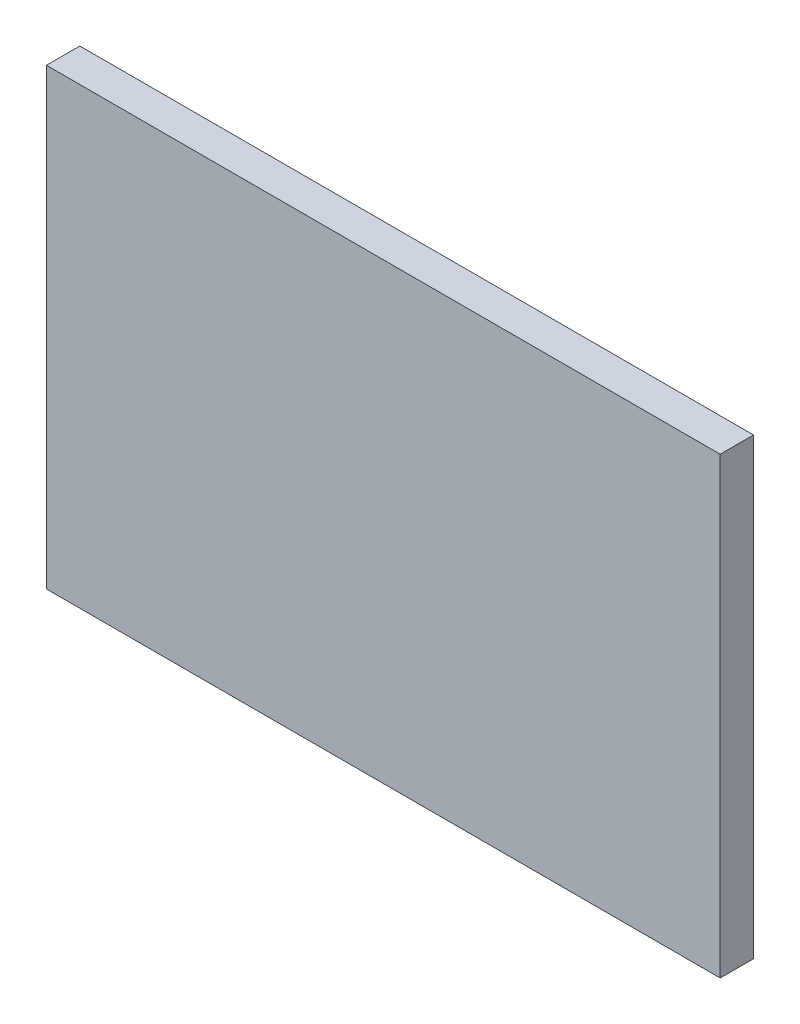
ISO-10303-21;
HEADER;
FILE_DESCRIPTION(('STEP AP214'),'2;1');
FILE_NAME('part.step','',(''),(''),'','','');
FILE_SCHEMA(('AUTOMOTIVE_DESIGN { 1 0 10303 214 1 1 1 1 }'));
ENDSEC;
DATA;
#1=APPLICATION_CONTEXT('core data for automotive mechanical design processes');
#2=APPLICATION_PROTOCOL_DEFINITION('international standard','automotive_design',2000,#1);
#3=PRODUCT_CONTEXT('',#1,'mechanical');
#4=PRODUCT('Part','Part','',(#3));
#5=PRODUCT_RELATED_PRODUCT_CATEGORY('part','',(#4));
#6=PRODUCT_DEFINITION_FORMATION('','',#4);
#7=PRODUCT_DEFINITION_CONTEXT('part definition',#1,'design');
#8=PRODUCT_DEFINITION('design','',#6,#7);
#9=PRODUCT_DEFINITION_SHAPE('','',#8);
#10=(LENGTH_UNIT() NAMED_UNIT(*) SI_UNIT(.MILLI.,.METRE.));
#11=(NAMED_UNIT(*) PLANE_ANGLE_UNIT() SI_UNIT($,.RADIAN.));
#12=(NAMED_UNIT(*) SI_UNIT($,.STERADIAN.) SOLID_ANGLE_UNIT());
#13=UNCERTAINTY_MEASURE_WITH_UNIT(LENGTH_MEASURE(1.E-05),#10,'distance_accuracy_value','');
#14=(GEOMETRIC_REPRESENTATION_CONTEXT(3) GLOBAL_UNCERTAINTY_ASSIGNED_CONTEXT((#13)) GLOBAL_UNIT_ASSIGNED_CONTEXT((#10,
#11,#12)) REPRESENTATION_CONTEXT('',''));
#15=CARTESIAN_POINT('',(0.,0.,0.));
#16=DIRECTION('',(0.,0.,1.));
#17=DIRECTION('',(1.,0.,0.));
#18=AXIS2_PLACEMENT_3D('',#15,#16,#17);
#19=CARTESIAN_POINT('',(50.5,34.,5.));
#20=DIRECTION('',(-1.,0.,0.));
#21=DIRECTION('',(0.,0.,1.));
#22=AXIS2_PLACEMENT_3D('',#19,#20,#21);
#23=PLANE('',#22);
#24=DIRECTION('',(0.,1.,0.));
#25=VECTOR('',#24,1.);
#26=CARTESIAN_POINT('',(50.5,34.,0.));
#27=LINE('',#26,#25);
#28=CARTESIAN_POINT('',(50.5,-34.,0.));
#29=VERTEX_POINT('',#28);
#30=CARTESIAN_POINT('',(50.5,34.,0.));
#31=VERTEX_POINT('',#30);
#32=EDGE_CURVE('E104',#29,#31,#27,.T.);
#33=ORIENTED_EDGE('',*,*,#32,.T.);
#34=DIRECTION('',(0.,0.,-1.));
#35=VECTOR('',#34,1.);
#36=CARTESIAN_POINT('',(50.5,34.,5.));
#37=LINE('',#36,#35);
#38=CARTESIAN_POINT('',(50.5,34.,5.));
#39=VERTEX_POINT('',#38);
#40=EDGE_CURVE('E11',#39,#31,#37,.T.);
#41=ORIENTED_EDGE('',*,*,#40,.F.);
#42=DIRECTION('',(0.,1.,0.));
#43=VECTOR('',#42,1.);
#44=CARTESIAN_POINT('',(50.5,34.,5.));
#45=LINE('',#44,#43);
#46=CARTESIAN_POINT('',(50.5,-34.,5.));
#47=VERTEX_POINT('',#46);
#48=EDGE_CURVE('E92',#47,#39,#45,.T.);
#49=ORIENTED_EDGE('',*,*,#48,.F.);
#50=DIRECTION('',(0.,0.,-1.));
#51=VECTOR('',#50,1.);
#52=CARTESIAN_POINT('',(50.5,-34.,5.));
#53=LINE('',#52,#51);
#54=EDGE_CURVE('E100',#47,#29,#53,.T.);
#55=ORIENTED_EDGE('',*,*,#54,.T.);
#56=EDGE_LOOP('',(#33,#41,#49,#55));
#57=FACE_BOUND('',#56,.T.);
#58=ADVANCED_FACE('F41',(#57),#23,.F.);
#59=CARTESIAN_POINT('',(-50.5,34.,5.));
#60=DIRECTION('',(0.,-1.,0.));
#61=DIRECTION('',(0.,0.,-1.));
#62=AXIS2_PLACEMENT_3D('',#59,#60,#61);
#63=PLANE('',#62);
#64=DIRECTION('',(-1.,0.,0.));
#65=VECTOR('',#64,1.);
#66=CARTESIAN_POINT('',(-50.5,34.,0.));
#67=LINE('',#66,#65);
#68=CARTESIAN_POINT('',(-50.5,34.,0.));
#69=VERTEX_POINT('',#68);
#70=EDGE_CURVE('E96',#31,#69,#67,.T.);
#71=ORIENTED_EDGE('',*,*,#70,.T.);
#72=DIRECTION('',(0.,0.,-1.));
#73=VECTOR('',#72,1.);
#74=CARTESIAN_POINT('',(-50.5,34.,5.));
#75=LINE('',#74,#73);
#76=CARTESIAN_POINT('',(-50.5,34.,5.));
#77=VERTEX_POINT('',#76);
#78=EDGE_CURVE('E49',#77,#69,#75,.T.);
#79=ORIENTED_EDGE('',*,*,#78,.F.);
#80=DIRECTION('',(-1.,0.,0.));
#81=VECTOR('',#80,1.);
#82=CARTESIAN_POINT('',(-50.5,34.,5.));
#83=LINE('',#82,#81);
#84=EDGE_CURVE('E87',#39,#77,#83,.T.);
#85=ORIENTED_EDGE('',*,*,#84,.F.);
#86=ORIENTED_EDGE('',*,*,#40,.T.);
#87=EDGE_LOOP('',(#71,#79,#85,#86));
#88=FACE_BOUND('',#87,.T.);
#89=ADVANCED_FACE('F95',(#88),#63,.F.);
#90=CARTESIAN_POINT('',(-50.5,34.,5.));
#91=DIRECTION('',(1.,0.,0.));
#92=DIRECTION('',(0.,0.,-1.));
#93=AXIS2_PLACEMENT_3D('',#90,#91,#92);
#94=PLANE('',#93);
#95=DIRECTION('',(0.,-1.,0.));
#96=VECTOR('',#95,1.);
#97=CARTESIAN_POINT('',(-50.5,34.,0.));
#98=LINE('',#97,#96);
#99=CARTESIAN_POINT('',(-50.5,-34.,0.));
#100=VERTEX_POINT('',#99);
#101=EDGE_CURVE('E74',#69,#100,#98,.T.);
#102=ORIENTED_EDGE('',*,*,#101,.T.);
#103=DIRECTION('',(0.,0.,-1.));
#104=VECTOR('',#103,1.);
#105=CARTESIAN_POINT('',(-50.5,-34.,5.));
#106=LINE('',#105,#104);
#107=CARTESIAN_POINT('',(-50.5,-34.,5.));
#108=VERTEX_POINT('',#107);
#109=EDGE_CURVE('E97',#108,#100,#106,.T.);
#110=ORIENTED_EDGE('',*,*,#109,.F.);
#111=DIRECTION('',(0.,-1.,0.));
#112=VECTOR('',#111,1.);
#113=CARTESIAN_POINT('',(-50.5,34.,5.));
#114=LINE('',#113,#112);
#115=EDGE_CURVE('E90',#77,#108,#114,.T.);
#116=ORIENTED_EDGE('',*,*,#115,.F.);
#117=ORIENTED_EDGE('',*,*,#78,.T.);
#118=EDGE_LOOP('',(#102,#110,#116,#117));
#119=FACE_BOUND('',#118,.T.);
#120=ADVANCED_FACE('F98',(#119),#94,.F.);
#121=CARTESIAN_POINT('',(-50.5,-34.,5.));
#122=DIRECTION('',(0.,1.,0.));
#123=DIRECTION('',(0.,0.,1.));
#124=AXIS2_PLACEMENT_3D('',#121,#122,#123);
#125=PLANE('',#124);
#126=DIRECTION('',(1.,0.,0.));
#127=VECTOR('',#126,1.);
#128=CARTESIAN_POINT('',(-50.5,-34.,0.));
#129=LINE('',#128,#127);
#130=EDGE_CURVE('E80',#100,#29,#129,.T.);
#131=ORIENTED_EDGE('',*,*,#130,.T.);
#132=ORIENTED_EDGE('',*,*,#54,.F.);
#133=DIRECTION('',(1.,0.,0.));
#134=VECTOR('',#133,1.);
#135=CARTESIAN_POINT('',(-50.5,-34.,5.));
#136=LINE('',#135,#134);
#137=EDGE_CURVE('E57',#108,#47,#136,.T.);
#138=ORIENTED_EDGE('',*,*,#137,.F.);
#139=ORIENTED_EDGE('',*,*,#109,.T.);
#140=EDGE_LOOP('',(#131,#132,#138,#139));
#141=FACE_BOUND('',#140,.T.);
#142=ADVANCED_FACE('F111',(#141),#125,.F.);
#143=CARTESIAN_POINT('',(0.,0.,5.));
#144=DIRECTION('',(0.,0.,1.));
#145=DIRECTION('',(1.,0.,0.));
#146=AXIS2_PLACEMENT_3D('',#143,#144,#145);
#147=PLANE('',#146);
#148=ORIENTED_EDGE('',*,*,#48,.T.);
#149=ORIENTED_EDGE('',*,*,#84,.T.);
#150=ORIENTED_EDGE('',*,*,#115,.T.);
#151=ORIENTED_EDGE('',*,*,#137,.T.);
#152=EDGE_LOOP('',(#148,#149,#150,#151));
#153=FACE_BOUND('',#152,.T.);
#154=ADVANCED_FACE('F88',(#153),#147,.T.);
#155=CARTESIAN_POINT('',(0.,0.,0.));
#156=DIRECTION('',(0.,0.,1.));
#157=DIRECTION('',(1.,0.,0.));
#158=AXIS2_PLACEMENT_3D('',#155,#156,#157);
#159=PLANE('',#158);
#160=ORIENTED_EDGE('',*,*,#32,.F.);
#161=ORIENTED_EDGE('',*,*,#130,.F.);
#162=ORIENTED_EDGE('',*,*,#101,.F.);
#163=ORIENTED_EDGE('',*,*,#70,.F.);
#164=EDGE_LOOP('',(#160,#161,#162,#163));
#165=FACE_BOUND('',#164,.T.);
#166=ADVANCED_FACE('F114',(#165),#159,.F.);
#167=CLOSED_SHELL('',(#58,#89,#120,#142,#154,#166));
#168=MANIFOLD_SOLID_BREP('B2',#167);
#169=ADVANCED_BREP_SHAPE_REPRESENTATION('',(#18,#168),#14);
#170=SHAPE_DEFINITION_REPRESENTATION(#9,#169);
ENDSEC;
END-ISO-10303-21;
